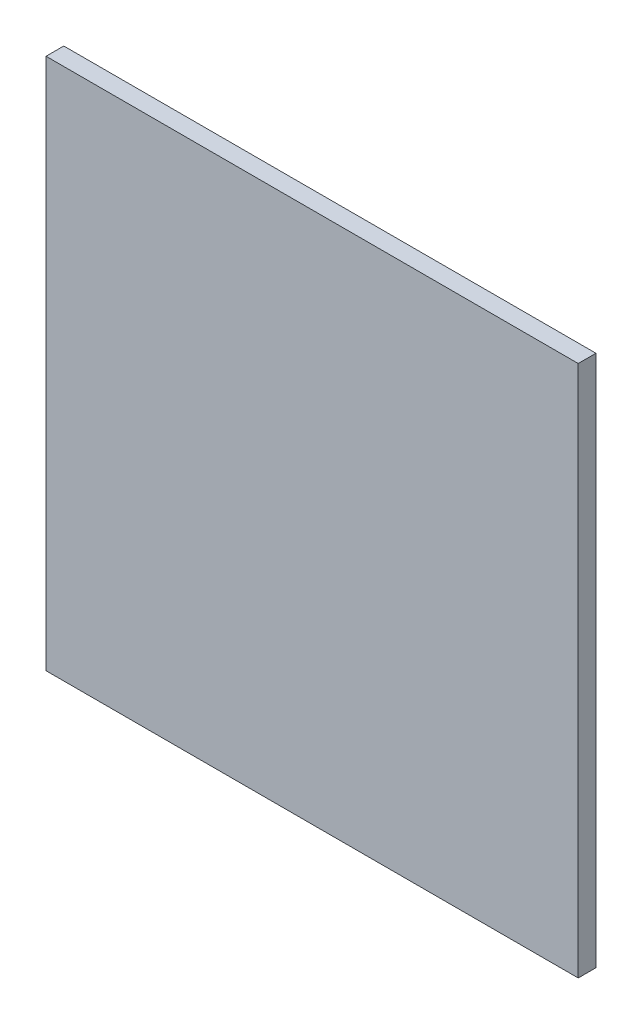
ISO-10303-21;
HEADER;
FILE_DESCRIPTION(('STEP AP214'),'2;1');
FILE_NAME('part.step','',(''),(''),'','','');
FILE_SCHEMA(('AUTOMOTIVE_DESIGN { 1 0 10303 214 1 1 1 1 }'));
ENDSEC;
DATA;
#1=APPLICATION_CONTEXT('core data for automotive mechanical design processes');
#2=APPLICATION_PROTOCOL_DEFINITION('international standard','automotive_design',2000,#1);
#3=PRODUCT_CONTEXT('',#1,'mechanical');
#4=PRODUCT('Part','Part','',(#3));
#5=PRODUCT_RELATED_PRODUCT_CATEGORY('part','',(#4));
#6=PRODUCT_DEFINITION_FORMATION('','',#4);
#7=PRODUCT_DEFINITION_CONTEXT('part definition',#1,'design');
#8=PRODUCT_DEFINITION('design','',#6,#7);
#9=PRODUCT_DEFINITION_SHAPE('','',#8);
#10=(LENGTH_UNIT() NAMED_UNIT(*) SI_UNIT(.MILLI.,.METRE.));
#11=(NAMED_UNIT(*) PLANE_ANGLE_UNIT() SI_UNIT($,.RADIAN.));
#12=(NAMED_UNIT(*) SI_UNIT($,.STERADIAN.) SOLID_ANGLE_UNIT());
#13=UNCERTAINTY_MEASURE_WITH_UNIT(LENGTH_MEASURE(1.E-05),#10,'distance_accuracy_value','');
#14=(GEOMETRIC_REPRESENTATION_CONTEXT(3) GLOBAL_UNCERTAINTY_ASSIGNED_CONTEXT((#13)) GLOBAL_UNIT_ASSIGNED_CONTEXT((#10,
#11,#12)) REPRESENTATION_CONTEXT('',''));
#15=CARTESIAN_POINT('',(0.,0.,0.));
#16=DIRECTION('',(0.,0.,1.));
#17=DIRECTION('',(1.,0.,0.));
#18=AXIS2_PLACEMENT_3D('',#15,#16,#17);
#19=CARTESIAN_POINT('',(26.9162547048336,20.7003961965135,2.));
#20=DIRECTION('',(-1.,0.,0.));
#21=DIRECTION('',(0.,-1.,0.));
#22=AXIS2_PLACEMENT_3D('',#19,#20,#21);
#23=PLANE('',#22);
#24=DIRECTION('',(0.,1.,0.));
#25=VECTOR('',#24,1.);
#26=CARTESIAN_POINT('',(26.9162547048336,20.7003961965135,0.));
#27=LINE('',#26,#25);
#28=CARTESIAN_POINT('',(26.9162547048336,-39.2996038034865,0.));
#29=VERTEX_POINT('',#28);
#30=CARTESIAN_POINT('',(26.9162547048336,20.7003961965135,0.));
#31=VERTEX_POINT('',#30);
#32=EDGE_CURVE('E96',#29,#31,#27,.T.);
#33=ORIENTED_EDGE('',*,*,#32,.T.);
#34=DIRECTION('',(0.,0.,-1.));
#35=VECTOR('',#34,1.);
#36=CARTESIAN_POINT('',(26.9162547048336,20.7003961965135,2.));
#37=LINE('',#36,#35);
#38=CARTESIAN_POINT('',(26.9162547048336,20.7003961965135,2.));
#39=VERTEX_POINT('',#38);
#40=EDGE_CURVE('E11',#39,#31,#37,.T.);
#41=ORIENTED_EDGE('',*,*,#40,.F.);
#42=DIRECTION('',(0.,1.,0.));
#43=VECTOR('',#42,1.);
#44=CARTESIAN_POINT('',(26.9162547048336,20.7003961965135,2.));
#45=LINE('',#44,#43);
#46=CARTESIAN_POINT('',(26.9162547048336,-39.2996038034865,2.));
#47=VERTEX_POINT('',#46);
#48=EDGE_CURVE('E84',#47,#39,#45,.T.);
#49=ORIENTED_EDGE('',*,*,#48,.F.);
#50=DIRECTION('',(0.,0.,-1.));
#51=VECTOR('',#50,1.);
#52=CARTESIAN_POINT('',(26.9162547048336,-39.2996038034865,2.));
#53=LINE('',#52,#51);
#54=EDGE_CURVE('E92',#47,#29,#53,.T.);
#55=ORIENTED_EDGE('',*,*,#54,.T.);
#56=EDGE_LOOP('',(#33,#41,#49,#55));
#57=FACE_BOUND('',#56,.T.);
#58=ADVANCED_FACE('F33',(#57),#23,.F.);
#59=CARTESIAN_POINT('',(26.9162547048336,20.7003961965135,2.));
#60=DIRECTION('',(0.,-1.,0.));
#61=DIRECTION('',(1.,0.,0.));
#62=AXIS2_PLACEMENT_3D('',#59,#60,#61);
#63=PLANE('',#62);
#64=DIRECTION('',(-1.,0.,0.));
#65=VECTOR('',#64,1.);
#66=CARTESIAN_POINT('',(26.9162547048336,20.7003961965135,0.));
#67=LINE('',#66,#65);
#68=CARTESIAN_POINT('',(-33.0837452951664,20.7003961965135,0.));
#69=VERTEX_POINT('',#68);
#70=EDGE_CURVE('E88',#31,#69,#67,.T.);
#71=ORIENTED_EDGE('',*,*,#70,.T.);
#72=DIRECTION('',(0.,0.,-1.));
#73=VECTOR('',#72,1.);
#74=CARTESIAN_POINT('',(-33.0837452951664,20.7003961965135,2.));
#75=LINE('',#74,#73);
#76=CARTESIAN_POINT('',(-33.0837452951664,20.7003961965135,2.));
#77=VERTEX_POINT('',#76);
#78=EDGE_CURVE('E41',#77,#69,#75,.T.);
#79=ORIENTED_EDGE('',*,*,#78,.F.);
#80=DIRECTION('',(-1.,0.,0.));
#81=VECTOR('',#80,1.);
#82=CARTESIAN_POINT('',(26.9162547048336,20.7003961965135,2.));
#83=LINE('',#82,#81);
#84=EDGE_CURVE('E79',#39,#77,#83,.T.);
#85=ORIENTED_EDGE('',*,*,#84,.F.);
#86=ORIENTED_EDGE('',*,*,#40,.T.);
#87=EDGE_LOOP('',(#71,#79,#85,#86));
#88=FACE_BOUND('',#87,.T.);
#89=ADVANCED_FACE('F87',(#88),#63,.F.);
#90=CARTESIAN_POINT('',(-33.0837452951664,20.7003961965135,2.));
#91=DIRECTION('',(1.,0.,0.));
#92=DIRECTION('',(0.,1.,0.));
#93=AXIS2_PLACEMENT_3D('',#90,#91,#92);
#94=PLANE('',#93);
#95=DIRECTION('',(0.,-1.,0.));
#96=VECTOR('',#95,1.);
#97=CARTESIAN_POINT('',(-33.0837452951664,20.7003961965135,0.));
#98=LINE('',#97,#96);
#99=CARTESIAN_POINT('',(-33.0837452951664,-39.2996038034865,0.));
#100=VERTEX_POINT('',#99);
#101=EDGE_CURVE('E66',#69,#100,#98,.T.);
#102=ORIENTED_EDGE('',*,*,#101,.T.);
#103=DIRECTION('',(0.,0.,-1.));
#104=VECTOR('',#103,1.);
#105=CARTESIAN_POINT('',(-33.0837452951664,-39.2996038034865,2.));
#106=LINE('',#105,#104);
#107=CARTESIAN_POINT('',(-33.0837452951664,-39.2996038034865,2.));
#108=VERTEX_POINT('',#107);
#109=EDGE_CURVE('E89',#108,#100,#106,.T.);
#110=ORIENTED_EDGE('',*,*,#109,.F.);
#111=DIRECTION('',(0.,-1.,0.));
#112=VECTOR('',#111,1.);
#113=CARTESIAN_POINT('',(-33.0837452951664,20.7003961965135,2.));
#114=LINE('',#113,#112);
#115=EDGE_CURVE('E82',#77,#108,#114,.T.);
#116=ORIENTED_EDGE('',*,*,#115,.F.);
#117=ORIENTED_EDGE('',*,*,#78,.T.);
#118=EDGE_LOOP('',(#102,#110,#116,#117));
#119=FACE_BOUND('',#118,.T.);
#120=ADVANCED_FACE('F90',(#119),#94,.F.);
#121=CARTESIAN_POINT('',(26.9162547048336,-39.2996038034865,2.));
#122=DIRECTION('',(0.,1.,0.));
#123=DIRECTION('',(-1.,0.,0.));
#124=AXIS2_PLACEMENT_3D('',#121,#122,#123);
#125=PLANE('',#124);
#126=DIRECTION('',(1.,0.,0.));
#127=VECTOR('',#126,1.);
#128=CARTESIAN_POINT('',(26.9162547048336,-39.2996038034865,0.));
#129=LINE('',#128,#127);
#130=EDGE_CURVE('E72',#100,#29,#129,.T.);
#131=ORIENTED_EDGE('',*,*,#130,.T.);
#132=ORIENTED_EDGE('',*,*,#54,.F.);
#133=DIRECTION('',(1.,0.,0.));
#134=VECTOR('',#133,1.);
#135=CARTESIAN_POINT('',(26.9162547048336,-39.2996038034865,2.));
#136=LINE('',#135,#134);
#137=EDGE_CURVE('E49',#108,#47,#136,.T.);
#138=ORIENTED_EDGE('',*,*,#137,.F.);
#139=ORIENTED_EDGE('',*,*,#109,.T.);
#140=EDGE_LOOP('',(#131,#132,#138,#139));
#141=FACE_BOUND('',#140,.T.);
#142=ADVANCED_FACE('F103',(#141),#125,.F.);
#143=CARTESIAN_POINT('',(0.,0.,2.));
#144=DIRECTION('',(0.,0.,-1.));
#145=DIRECTION('',(-1.,0.,0.));
#146=AXIS2_PLACEMENT_3D('',#143,#144,#145);
#147=PLANE('',#146);
#148=ORIENTED_EDGE('',*,*,#48,.T.);
#149=ORIENTED_EDGE('',*,*,#84,.T.);
#150=ORIENTED_EDGE('',*,*,#115,.T.);
#151=ORIENTED_EDGE('',*,*,#137,.T.);
#152=EDGE_LOOP('',(#148,#149,#150,#151));
#153=FACE_BOUND('',#152,.T.);
#154=ADVANCED_FACE('F80',(#153),#147,.F.);
#155=CARTESIAN_POINT('',(0.,0.,0.));
#156=DIRECTION('',(0.,0.,-1.));
#157=DIRECTION('',(-1.,0.,0.));
#158=AXIS2_PLACEMENT_3D('',#155,#156,#157);
#159=PLANE('',#158);
#160=ORIENTED_EDGE('',*,*,#32,.F.);
#161=ORIENTED_EDGE('',*,*,#130,.F.);
#162=ORIENTED_EDGE('',*,*,#101,.F.);
#163=ORIENTED_EDGE('',*,*,#70,.F.);
#164=EDGE_LOOP('',(#160,#161,#162,#163));
#165=FACE_BOUND('',#164,.T.);
#166=ADVANCED_FACE('F106',(#165),#159,.T.);
#167=CLOSED_SHELL('',(#58,#89,#120,#142,#154,#166));
#168=MANIFOLD_SOLID_BREP('B2',#167);
#169=ADVANCED_BREP_SHAPE_REPRESENTATION('',(#18,#168),#14);
#170=SHAPE_DEFINITION_REPRESENTATION(#9,#169);
ENDSEC;
END-ISO-10303-21;
